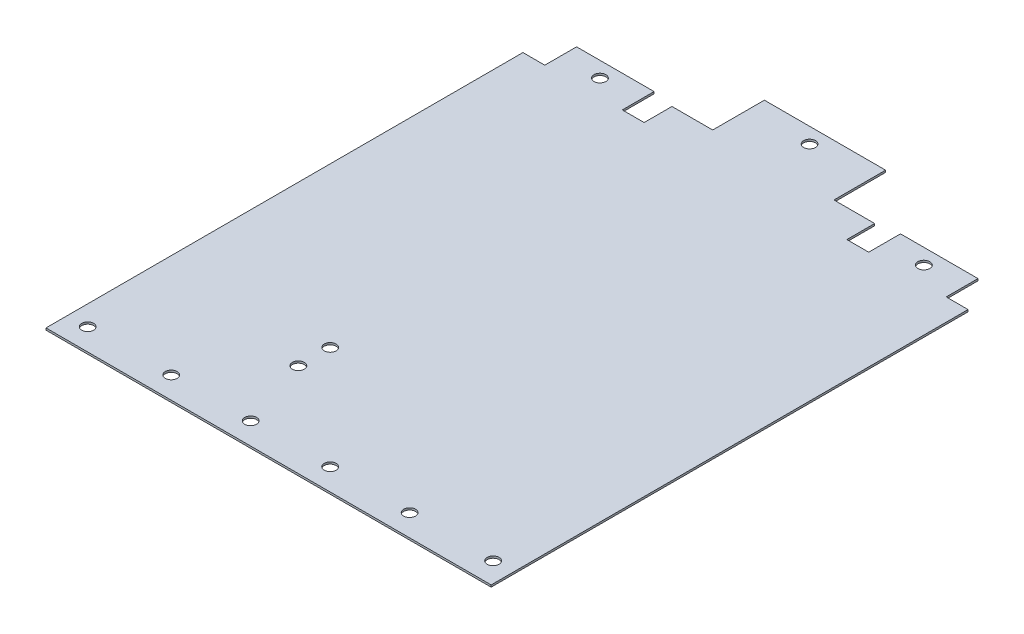
ISO-10303-21;
HEADER;
FILE_DESCRIPTION(('STEP AP214'),'2;1');
FILE_NAME('part.step','',(''),(''),'','','');
FILE_SCHEMA(('AUTOMOTIVE_DESIGN { 1 0 10303 214 1 1 1 1 }'));
ENDSEC;
DATA;
#1=APPLICATION_CONTEXT('core data for automotive mechanical design processes');
#2=APPLICATION_PROTOCOL_DEFINITION('international standard','automotive_design',2000,#1);
#3=PRODUCT_CONTEXT('',#1,'mechanical');
#4=PRODUCT('Part','Part','',(#3));
#5=PRODUCT_RELATED_PRODUCT_CATEGORY('part','',(#4));
#6=PRODUCT_DEFINITION_FORMATION('','',#4);
#7=PRODUCT_DEFINITION_CONTEXT('part definition',#1,'design');
#8=PRODUCT_DEFINITION('design','',#6,#7);
#9=PRODUCT_DEFINITION_SHAPE('','',#8);
#10=(LENGTH_UNIT() NAMED_UNIT(*) SI_UNIT(.MILLI.,.METRE.));
#11=(NAMED_UNIT(*) PLANE_ANGLE_UNIT() SI_UNIT($,.RADIAN.));
#12=(NAMED_UNIT(*) SI_UNIT($,.STERADIAN.) SOLID_ANGLE_UNIT());
#13=UNCERTAINTY_MEASURE_WITH_UNIT(LENGTH_MEASURE(1.E-05),#10,'distance_accuracy_value','');
#14=(GEOMETRIC_REPRESENTATION_CONTEXT(3) GLOBAL_UNCERTAINTY_ASSIGNED_CONTEXT((#13)) GLOBAL_UNIT_ASSIGNED_CONTEXT((#10,
#11,#12)) REPRESENTATION_CONTEXT('',''));
#15=CARTESIAN_POINT('',(0.,0.,0.));
#16=DIRECTION('',(0.,0.,1.));
#17=DIRECTION('',(1.,0.,0.));
#18=AXIS2_PLACEMENT_3D('',#15,#16,#17);
#19=CARTESIAN_POINT('',(-56.,-0.5,-70.));
#20=DIRECTION('',(-1.,0.,0.));
#21=DIRECTION('',(0.,0.,1.));
#22=AXIS2_PLACEMENT_3D('',#19,#20,#21);
#23=PLANE('',#22);
#24=DIRECTION('',(0.,0.,1.));
#25=VECTOR('',#24,1.);
#26=CARTESIAN_POINT('',(-56.,0.,-70.));
#27=LINE('',#26,#25);
#28=CARTESIAN_POINT('',(-56.,0.,-50.));
#29=VERTEX_POINT('',#28);
#30=CARTESIAN_POINT('',(-56.,0.,70.));
#31=VERTEX_POINT('',#30);
#32=EDGE_CURVE('E305',#29,#31,#27,.T.);
#33=ORIENTED_EDGE('',*,*,#32,.F.);
#34=DIRECTION('',(0.,1.,0.));
#35=VECTOR('',#34,1.);
#36=CARTESIAN_POINT('',(-56.,-10.,-50.));
#37=LINE('',#36,#35);
#38=CARTESIAN_POINT('',(-56.,-0.5,-50.));
#39=VERTEX_POINT('',#38);
#40=EDGE_CURVE('E265',#39,#29,#37,.T.);
#41=ORIENTED_EDGE('',*,*,#40,.F.);
#42=DIRECTION('',(0.,0.,1.));
#43=VECTOR('',#42,1.);
#44=CARTESIAN_POINT('',(-56.,-0.5,-70.));
#45=LINE('',#44,#43);
#46=CARTESIAN_POINT('',(-56.,-0.5,70.));
#47=VERTEX_POINT('',#46);
#48=EDGE_CURVE('E306',#39,#47,#45,.T.);
#49=ORIENTED_EDGE('',*,*,#48,.T.);
#50=DIRECTION('',(0.,1.,0.));
#51=VECTOR('',#50,1.);
#52=CARTESIAN_POINT('',(-56.,-0.5,70.));
#53=LINE('',#52,#51);
#54=EDGE_CURVE('E317',#47,#31,#53,.T.);
#55=ORIENTED_EDGE('',*,*,#54,.T.);
#56=EDGE_LOOP('',(#33,#41,#49,#55));
#57=FACE_BOUND('',#56,.T.);
#58=ADVANCED_FACE('F34',(#57),#23,.T.);
#59=CARTESIAN_POINT('',(56.,-0.5,-70.));
#60=DIRECTION('',(0.,0.,-1.));
#61=DIRECTION('',(-1.,0.,0.));
#62=AXIS2_PLACEMENT_3D('',#59,#60,#61);
#63=PLANE('',#62);
#64=DIRECTION('',(0.,1.,0.));
#65=VECTOR('',#64,1.);
#66=CARTESIAN_POINT('',(15.2500000000115,-10.,-70.));
#67=LINE('',#66,#65);
#68=CARTESIAN_POINT('',(15.2500000000115,-0.5,-70.));
#69=VERTEX_POINT('',#68);
#70=CARTESIAN_POINT('',(15.2500000000115,0.,-70.));
#71=VERTEX_POINT('',#70);
#72=EDGE_CURVE('E175',#69,#71,#67,.T.);
#73=ORIENTED_EDGE('',*,*,#72,.F.);
#74=DIRECTION('',(-1.,0.,0.));
#75=VECTOR('',#74,1.);
#76=CARTESIAN_POINT('',(56.,-0.5,-70.));
#77=LINE('',#76,#75);
#78=CARTESIAN_POINT('',(-15.2500000000135,-0.5,-70.));
#79=VERTEX_POINT('',#78);
#80=EDGE_CURVE('E315',#69,#79,#77,.T.);
#81=ORIENTED_EDGE('',*,*,#80,.T.);
#82=DIRECTION('',(0.,1.,0.));
#83=VECTOR('',#82,1.);
#84=CARTESIAN_POINT('',(-15.2500000000135,-10.,-70.));
#85=LINE('',#84,#83);
#86=CARTESIAN_POINT('',(-15.2500000000135,0.,-70.));
#87=VERTEX_POINT('',#86);
#88=EDGE_CURVE('E268',#79,#87,#85,.T.);
#89=ORIENTED_EDGE('',*,*,#88,.T.);
#90=DIRECTION('',(-1.,0.,0.));
#91=VECTOR('',#90,1.);
#92=CARTESIAN_POINT('',(56.,0.,-70.));
#93=LINE('',#92,#91);
#94=EDGE_CURVE('E309',#71,#87,#93,.T.);
#95=ORIENTED_EDGE('',*,*,#94,.F.);
#96=EDGE_LOOP('',(#73,#81,#89,#95));
#97=FACE_BOUND('',#96,.T.);
#98=ADVANCED_FACE('F357',(#97),#63,.T.);
#99=CARTESIAN_POINT('',(-56.,-0.5,70.));
#100=DIRECTION('',(0.,-1.,0.));
#101=DIRECTION('',(0.,0.,-1.));
#102=AXIS2_PLACEMENT_3D('',#99,#100,#101);
#103=PLANE('',#102);
#104=CARTESIAN_POINT('',(51.,-0.5,64.5));
#105=DIRECTION('',(0.,-1.,0.));
#106=DIRECTION('',(0.,0.,-1.));
#107=AXIS2_PLACEMENT_3D('',#104,#105,#106);
#108=CIRCLE('',#107,1.5);
#109=CARTESIAN_POINT('',(51.,-0.5,63.));
#110=VERTEX_POINT('',#109);
#111=EDGE_CURVE('E473',#110,#110,#108,.T.);
#112=ORIENTED_EDGE('',*,*,#111,.F.);
#113=EDGE_LOOP('',(#112));
#114=FACE_BOUND('',#113,.T.);
#115=CARTESIAN_POINT('',(-51.,-0.5,64.5));
#116=DIRECTION('',(0.,-1.,0.));
#117=DIRECTION('',(0.,0.,-1.));
#118=AXIS2_PLACEMENT_3D('',#115,#116,#117);
#119=CIRCLE('',#118,1.5);
#120=CARTESIAN_POINT('',(-51.,-0.5,63.));
#121=VERTEX_POINT('',#120);
#122=EDGE_CURVE('E483',#121,#121,#119,.T.);
#123=ORIENTED_EDGE('',*,*,#122,.F.);
#124=EDGE_LOOP('',(#123));
#125=FACE_BOUND('',#124,.T.);
#126=CARTESIAN_POINT('',(10.,-0.5,64.5));
#127=DIRECTION('',(0.,-1.,0.));
#128=DIRECTION('',(0.,0.,-1.));
#129=AXIS2_PLACEMENT_3D('',#126,#127,#128);
#130=CIRCLE('',#129,1.5);
#131=CARTESIAN_POINT('',(10.,-0.5,63.));
#132=VERTEX_POINT('',#131);
#133=EDGE_CURVE('E489',#132,#132,#130,.T.);
#134=ORIENTED_EDGE('',*,*,#133,.F.);
#135=EDGE_LOOP('',(#134));
#136=FACE_BOUND('',#135,.T.);
#137=CARTESIAN_POINT('',(30.,-0.5,64.5));
#138=DIRECTION('',(0.,-1.,0.));
#139=DIRECTION('',(0.,0.,-1.));
#140=AXIS2_PLACEMENT_3D('',#137,#138,#139);
#141=CIRCLE('',#140,1.5);
#142=CARTESIAN_POINT('',(30.,-0.5,63.));
#143=VERTEX_POINT('',#142);
#144=EDGE_CURVE('E495',#143,#143,#141,.T.);
#145=ORIENTED_EDGE('',*,*,#144,.F.);
#146=EDGE_LOOP('',(#145));
#147=FACE_BOUND('',#146,.T.);
#148=CARTESIAN_POINT('',(-30.,-0.5,64.5));
#149=DIRECTION('',(0.,-1.,0.));
#150=DIRECTION('',(0.,0.,-1.));
#151=AXIS2_PLACEMENT_3D('',#148,#149,#150);
#152=CIRCLE('',#151,1.5);
#153=CARTESIAN_POINT('',(-30.,-0.5,63.));
#154=VERTEX_POINT('',#153);
#155=EDGE_CURVE('E501',#154,#154,#152,.T.);
#156=ORIENTED_EDGE('',*,*,#155,.F.);
#157=EDGE_LOOP('',(#156));
#158=FACE_BOUND('',#157,.T.);
#159=CARTESIAN_POINT('',(-10.,-0.5,64.5));
#160=DIRECTION('',(0.,-1.,0.));
#161=DIRECTION('',(0.,0.,-1.));
#162=AXIS2_PLACEMENT_3D('',#159,#160,#161);
#163=CIRCLE('',#162,1.5);
#164=CARTESIAN_POINT('',(-10.,-0.5,63.));
#165=VERTEX_POINT('',#164);
#166=EDGE_CURVE('E507',#165,#165,#163,.T.);
#167=ORIENTED_EDGE('',*,*,#166,.F.);
#168=EDGE_LOOP('',(#167));
#169=FACE_BOUND('',#168,.T.);
#170=CARTESIAN_POINT('',(-16.,-0.5,46.5));
#171=DIRECTION('',(0.,-1.,0.));
#172=DIRECTION('',(0.,0.,-1.));
#173=AXIS2_PLACEMENT_3D('',#170,#171,#172);
#174=CIRCLE('',#173,1.5);
#175=CARTESIAN_POINT('',(-16.,-0.5,45.));
#176=VERTEX_POINT('',#175);
#177=EDGE_CURVE('E513',#176,#176,#174,.T.);
#178=ORIENTED_EDGE('',*,*,#177,.F.);
#179=EDGE_LOOP('',(#178));
#180=FACE_BOUND('',#179,.T.);
#181=CARTESIAN_POINT('',(-16.,-0.5,38.5));
#182=DIRECTION('',(0.,-1.,0.));
#183=DIRECTION('',(0.,0.,-1.));
#184=AXIS2_PLACEMENT_3D('',#181,#182,#183);
#185=CIRCLE('',#184,1.5);
#186=CARTESIAN_POINT('',(-16.,-0.5,37.));
#187=VERTEX_POINT('',#186);
#188=EDGE_CURVE('E519',#187,#187,#185,.T.);
#189=ORIENTED_EDGE('',*,*,#188,.F.);
#190=EDGE_LOOP('',(#189));
#191=FACE_BOUND('',#190,.T.);
#192=CARTESIAN_POINT('',(40.75,-0.5,-54.125));
#193=DIRECTION('',(0.,-1.,0.));
#194=DIRECTION('',(0.,0.,-1.));
#195=AXIS2_PLACEMENT_3D('',#192,#193,#194);
#196=CIRCLE('',#195,1.5);
#197=CARTESIAN_POINT('',(40.75,-0.5,-55.625));
#198=VERTEX_POINT('',#197);
#199=EDGE_CURVE('E525',#198,#198,#196,.T.);
#200=ORIENTED_EDGE('',*,*,#199,.F.);
#201=EDGE_LOOP('',(#200));
#202=FACE_BOUND('',#201,.T.);
#203=CARTESIAN_POINT('',(0.,-0.5,-66.125));
#204=DIRECTION('',(0.,-1.,0.));
#205=DIRECTION('',(0.,0.,-1.));
#206=AXIS2_PLACEMENT_3D('',#203,#204,#205);
#207=CIRCLE('',#206,1.5);
#208=CARTESIAN_POINT('',(0.,-0.5,-67.625));
#209=VERTEX_POINT('',#208);
#210=EDGE_CURVE('E531',#209,#209,#207,.T.);
#211=ORIENTED_EDGE('',*,*,#210,.F.);
#212=EDGE_LOOP('',(#211));
#213=FACE_BOUND('',#212,.T.);
#214=CARTESIAN_POINT('',(-40.75,-0.5,-54.125));
#215=DIRECTION('',(0.,-1.,0.));
#216=DIRECTION('',(0.,0.,-1.));
#217=AXIS2_PLACEMENT_3D('',#214,#215,#216);
#218=CIRCLE('',#217,1.5);
#219=CARTESIAN_POINT('',(-40.75,-0.5,-55.625));
#220=VERTEX_POINT('',#219);
#221=EDGE_CURVE('E186',#220,#220,#218,.T.);
#222=ORIENTED_EDGE('',*,*,#221,.F.);
#223=EDGE_LOOP('',(#222));
#224=FACE_BOUND('',#223,.T.);
#225=DIRECTION('',(0.,0.,-1.));
#226=VECTOR('',#225,1.);
#227=CARTESIAN_POINT('',(15.25,-0.5,70.));
#228=LINE('',#227,#226);
#229=CARTESIAN_POINT('',(15.25,-0.5,-57.));
#230=VERTEX_POINT('',#229);
#231=EDGE_CURVE('E226',#230,#69,#228,.T.);
#232=ORIENTED_EDGE('',*,*,#231,.F.);
#233=DIRECTION('',(-1.,0.,0.));
#234=VECTOR('',#233,1.);
#235=CARTESIAN_POINT('',(-56.,-0.5,-57.));
#236=LINE('',#235,#234);
#237=CARTESIAN_POINT('',(25.5,-0.5,-57.));
#238=VERTEX_POINT('',#237);
#239=EDGE_CURVE('E228',#238,#230,#236,.T.);
#240=ORIENTED_EDGE('',*,*,#239,.F.);
#241=DIRECTION('',(0.,0.,-1.));
#242=VECTOR('',#241,1.);
#243=CARTESIAN_POINT('',(25.5000000000001,-0.5,69.9999999999999));
#244=LINE('',#243,#242);
#245=CARTESIAN_POINT('',(25.5,-0.5,-50.));
#246=VERTEX_POINT('',#245);
#247=EDGE_CURVE('E230',#246,#238,#244,.T.);
#248=ORIENTED_EDGE('',*,*,#247,.F.);
#249=DIRECTION('',(-1.,0.,0.));
#250=VECTOR('',#249,1.);
#251=CARTESIAN_POINT('',(-55.9999999999998,-0.5,-50.0000000000001));
#252=LINE('',#251,#250);
#253=CARTESIAN_POINT('',(31.,-0.5,-50.));
#254=VERTEX_POINT('',#253);
#255=EDGE_CURVE('E232',#254,#246,#252,.T.);
#256=ORIENTED_EDGE('',*,*,#255,.F.);
#257=DIRECTION('',(0.,0.,-1.));
#258=VECTOR('',#257,1.);
#259=CARTESIAN_POINT('',(30.9999999999999,-0.5,70.0000000000001));
#260=LINE('',#259,#258);
#261=CARTESIAN_POINT('',(31.,-0.5,-58.));
#262=VERTEX_POINT('',#261);
#263=EDGE_CURVE('E234',#254,#262,#260,.T.);
#264=ORIENTED_EDGE('',*,*,#263,.T.);
#265=DIRECTION('',(1.,0.,0.));
#266=VECTOR('',#265,1.);
#267=CARTESIAN_POINT('',(-56.,-0.5,-58.));
#268=LINE('',#267,#266);
#269=CARTESIAN_POINT('',(50.5,-0.5,-58.));
#270=VERTEX_POINT('',#269);
#271=EDGE_CURVE('E237',#262,#270,#268,.T.);
#272=ORIENTED_EDGE('',*,*,#271,.T.);
#273=DIRECTION('',(0.,0.,-1.));
#274=VECTOR('',#273,1.);
#275=CARTESIAN_POINT('',(50.5000000000001,-0.5,69.9999999999999));
#276=LINE('',#275,#274);
#277=CARTESIAN_POINT('',(50.5,-0.5,-50.));
#278=VERTEX_POINT('',#277);
#279=EDGE_CURVE('E240',#278,#270,#276,.T.);
#280=ORIENTED_EDGE('',*,*,#279,.F.);
#281=DIRECTION('',(-1.,0.,0.));
#282=VECTOR('',#281,1.);
#283=CARTESIAN_POINT('',(-56.0000000000001,-0.5,-49.9999999999999));
#284=LINE('',#283,#282);
#285=CARTESIAN_POINT('',(56.,-0.5,-50.));
#286=VERTEX_POINT('',#285);
#287=EDGE_CURVE('E172',#286,#278,#284,.T.);
#288=ORIENTED_EDGE('',*,*,#287,.F.);
#289=DIRECTION('',(0.,0.,-1.));
#290=VECTOR('',#289,1.);
#291=CARTESIAN_POINT('',(56.,-0.5,-70.));
#292=LINE('',#291,#290);
#293=CARTESIAN_POINT('',(56.,-0.5,70.));
#294=VERTEX_POINT('',#293);
#295=EDGE_CURVE('E312',#294,#286,#292,.T.);
#296=ORIENTED_EDGE('',*,*,#295,.F.);
#297=DIRECTION('',(1.,0.,0.));
#298=VECTOR('',#297,1.);
#299=CARTESIAN_POINT('',(56.,-0.5,70.));
#300=LINE('',#299,#298);
#301=EDGE_CURVE('E308',#47,#294,#300,.T.);
#302=ORIENTED_EDGE('',*,*,#301,.F.);
#303=ORIENTED_EDGE('',*,*,#48,.F.);
#304=DIRECTION('',(1.,0.,0.));
#305=VECTOR('',#304,1.);
#306=CARTESIAN_POINT('',(-56.0000000000001,-0.5,-50.));
#307=LINE('',#306,#305);
#308=CARTESIAN_POINT('',(-50.5,-0.5,-50.));
#309=VERTEX_POINT('',#308);
#310=EDGE_CURVE('E302',#39,#309,#307,.T.);
#311=ORIENTED_EDGE('',*,*,#310,.T.);
#312=DIRECTION('',(0.,0.,-1.));
#313=VECTOR('',#312,1.);
#314=CARTESIAN_POINT('',(-50.5000000000001,-0.5,70.));
#315=LINE('',#314,#313);
#316=CARTESIAN_POINT('',(-50.5,-0.5,-58.));
#317=VERTEX_POINT('',#316);
#318=EDGE_CURVE('E267',#309,#317,#315,.T.);
#319=ORIENTED_EDGE('',*,*,#318,.T.);
#320=DIRECTION('',(-1.,0.,0.));
#321=VECTOR('',#320,1.);
#322=CARTESIAN_POINT('',(-56.,-0.5,-58.));
#323=LINE('',#322,#321);
#324=CARTESIAN_POINT('',(-31.,-0.5,-58.));
#325=VERTEX_POINT('',#324);
#326=EDGE_CURVE('E286',#325,#317,#323,.T.);
#327=ORIENTED_EDGE('',*,*,#326,.F.);
#328=DIRECTION('',(0.,0.,-1.));
#329=VECTOR('',#328,1.);
#330=CARTESIAN_POINT('',(-30.9999999999999,-0.5,70.));
#331=LINE('',#330,#329);
#332=CARTESIAN_POINT('',(-31.,-0.5,-50.));
#333=VERTEX_POINT('',#332);
#334=EDGE_CURVE('E288',#333,#325,#331,.T.);
#335=ORIENTED_EDGE('',*,*,#334,.F.);
#336=DIRECTION('',(1.,0.,0.));
#337=VECTOR('',#336,1.);
#338=CARTESIAN_POINT('',(-56.,-0.5,-50.));
#339=LINE('',#338,#337);
#340=CARTESIAN_POINT('',(-25.5,-0.5,-50.));
#341=VERTEX_POINT('',#340);
#342=EDGE_CURVE('E290',#333,#341,#339,.T.);
#343=ORIENTED_EDGE('',*,*,#342,.T.);
#344=DIRECTION('',(0.,0.,-1.));
#345=VECTOR('',#344,1.);
#346=CARTESIAN_POINT('',(-25.5,-0.5,70.));
#347=LINE('',#346,#345);
#348=CARTESIAN_POINT('',(-25.5,-0.5,-57.));
#349=VERTEX_POINT('',#348);
#350=EDGE_CURVE('E293',#341,#349,#347,.T.);
#351=ORIENTED_EDGE('',*,*,#350,.T.);
#352=DIRECTION('',(1.,0.,0.));
#353=VECTOR('',#352,1.);
#354=CARTESIAN_POINT('',(-56.,-0.5,-57.));
#355=LINE('',#354,#353);
#356=CARTESIAN_POINT('',(-15.25,-0.5,-57.));
#357=VERTEX_POINT('',#356);
#358=EDGE_CURVE('E296',#349,#357,#355,.T.);
#359=ORIENTED_EDGE('',*,*,#358,.T.);
#360=DIRECTION('',(0.,0.,-1.));
#361=VECTOR('',#360,1.);
#362=CARTESIAN_POINT('',(-15.25,-0.5,70.));
#363=LINE('',#362,#361);
#364=EDGE_CURVE('E299',#357,#79,#363,.T.);
#365=ORIENTED_EDGE('',*,*,#364,.T.);
#366=ORIENTED_EDGE('',*,*,#80,.F.);
#367=EDGE_LOOP('',(#232,#240,#248,#256,#264,#272,#280,#288,#296,#302,#303,#311,#319,#327,#335,
#343,#351,#359,#365,#366));
#368=FACE_BOUND('',#367,.T.);
#369=ADVANCED_FACE('F342',(#114,#125,#136,#147,#158,#169,#180,#191,#202,#213,#224,#368),#103,.T.);
#370=CARTESIAN_POINT('',(-56.,0.,70.));
#371=DIRECTION('',(0.,-1.,0.));
#372=DIRECTION('',(0.,0.,-1.));
#373=AXIS2_PLACEMENT_3D('',#370,#371,#372);
#374=PLANE('',#373);
#375=CARTESIAN_POINT('',(51.,0.,64.5));
#376=DIRECTION('',(0.,1.,0.));
#377=DIRECTION('',(0.,0.,-1.));
#378=AXIS2_PLACEMENT_3D('',#375,#376,#377);
#379=CIRCLE('',#378,1.5);
#380=CARTESIAN_POINT('',(51.,0.,63.));
#381=VERTEX_POINT('',#380);
#382=EDGE_CURVE('E476',#381,#381,#379,.T.);
#383=ORIENTED_EDGE('',*,*,#382,.F.);
#384=EDGE_LOOP('',(#383));
#385=FACE_BOUND('',#384,.T.);
#386=CARTESIAN_POINT('',(-51.,0.,64.5));
#387=DIRECTION('',(0.,1.,0.));
#388=DIRECTION('',(0.,0.,1.));
#389=AXIS2_PLACEMENT_3D('',#386,#387,#388);
#390=CIRCLE('',#389,1.5);
#391=CARTESIAN_POINT('',(-51.,0.,66.));
#392=VERTEX_POINT('',#391);
#393=EDGE_CURVE('E478',#392,#392,#390,.T.);
#394=ORIENTED_EDGE('',*,*,#393,.F.);
#395=EDGE_LOOP('',(#394));
#396=FACE_BOUND('',#395,.T.);
#397=CARTESIAN_POINT('',(10.,0.,64.5));
#398=DIRECTION('',(0.,1.,0.));
#399=DIRECTION('',(0.,0.,-1.));
#400=AXIS2_PLACEMENT_3D('',#397,#398,#399);
#401=CIRCLE('',#400,1.5);
#402=CARTESIAN_POINT('',(10.,0.,63.));
#403=VERTEX_POINT('',#402);
#404=EDGE_CURVE('E486',#403,#403,#401,.T.);
#405=ORIENTED_EDGE('',*,*,#404,.F.);
#406=EDGE_LOOP('',(#405));
#407=FACE_BOUND('',#406,.T.);
#408=CARTESIAN_POINT('',(30.,0.,64.5));
#409=DIRECTION('',(0.,1.,0.));
#410=DIRECTION('',(0.,0.,-1.));
#411=AXIS2_PLACEMENT_3D('',#408,#409,#410);
#412=CIRCLE('',#411,1.5);
#413=CARTESIAN_POINT('',(30.,0.,63.));
#414=VERTEX_POINT('',#413);
#415=EDGE_CURVE('E492',#414,#414,#412,.T.);
#416=ORIENTED_EDGE('',*,*,#415,.F.);
#417=EDGE_LOOP('',(#416));
#418=FACE_BOUND('',#417,.T.);
#419=CARTESIAN_POINT('',(-30.,0.,64.5));
#420=DIRECTION('',(0.,1.,0.));
#421=DIRECTION('',(0.,0.,1.));
#422=AXIS2_PLACEMENT_3D('',#419,#420,#421);
#423=CIRCLE('',#422,1.5);
#424=CARTESIAN_POINT('',(-30.,0.,66.));
#425=VERTEX_POINT('',#424);
#426=EDGE_CURVE('E498',#425,#425,#423,.T.);
#427=ORIENTED_EDGE('',*,*,#426,.F.);
#428=EDGE_LOOP('',(#427));
#429=FACE_BOUND('',#428,.T.);
#430=CARTESIAN_POINT('',(-10.,0.,64.5));
#431=DIRECTION('',(0.,1.,0.));
#432=DIRECTION('',(0.,0.,1.));
#433=AXIS2_PLACEMENT_3D('',#430,#431,#432);
#434=CIRCLE('',#433,1.5);
#435=CARTESIAN_POINT('',(-10.,0.,66.));
#436=VERTEX_POINT('',#435);
#437=EDGE_CURVE('E504',#436,#436,#434,.T.);
#438=ORIENTED_EDGE('',*,*,#437,.F.);
#439=EDGE_LOOP('',(#438));
#440=FACE_BOUND('',#439,.T.);
#441=CARTESIAN_POINT('',(-16.,0.,46.5));
#442=DIRECTION('',(0.,1.,0.));
#443=DIRECTION('',(0.,0.,-1.));
#444=AXIS2_PLACEMENT_3D('',#441,#442,#443);
#445=CIRCLE('',#444,1.5);
#446=CARTESIAN_POINT('',(-16.,0.,45.));
#447=VERTEX_POINT('',#446);
#448=EDGE_CURVE('E510',#447,#447,#445,.T.);
#449=ORIENTED_EDGE('',*,*,#448,.F.);
#450=EDGE_LOOP('',(#449));
#451=FACE_BOUND('',#450,.T.);
#452=CARTESIAN_POINT('',(-16.,0.,38.5));
#453=DIRECTION('',(0.,1.,0.));
#454=DIRECTION('',(0.,0.,1.));
#455=AXIS2_PLACEMENT_3D('',#452,#453,#454);
#456=CIRCLE('',#455,1.5);
#457=CARTESIAN_POINT('',(-16.,0.,40.));
#458=VERTEX_POINT('',#457);
#459=EDGE_CURVE('E516',#458,#458,#456,.T.);
#460=ORIENTED_EDGE('',*,*,#459,.F.);
#461=EDGE_LOOP('',(#460));
#462=FACE_BOUND('',#461,.T.);
#463=CARTESIAN_POINT('',(40.75,0.,-54.125));
#464=DIRECTION('',(0.,1.,0.));
#465=DIRECTION('',(0.,0.,-1.));
#466=AXIS2_PLACEMENT_3D('',#463,#464,#465);
#467=CIRCLE('',#466,1.5);
#468=CARTESIAN_POINT('',(40.75,0.,-55.625));
#469=VERTEX_POINT('',#468);
#470=EDGE_CURVE('E522',#469,#469,#467,.T.);
#471=ORIENTED_EDGE('',*,*,#470,.F.);
#472=EDGE_LOOP('',(#471));
#473=FACE_BOUND('',#472,.T.);
#474=CARTESIAN_POINT('',(0.,0.,-66.125));
#475=DIRECTION('',(0.,1.,0.));
#476=DIRECTION('',(0.,0.,1.));
#477=AXIS2_PLACEMENT_3D('',#474,#475,#476);
#478=CIRCLE('',#477,1.5);
#479=CARTESIAN_POINT('',(0.,0.,-64.625));
#480=VERTEX_POINT('',#479);
#481=EDGE_CURVE('E528',#480,#480,#478,.T.);
#482=ORIENTED_EDGE('',*,*,#481,.F.);
#483=EDGE_LOOP('',(#482));
#484=FACE_BOUND('',#483,.T.);
#485=CARTESIAN_POINT('',(-40.75,0.,-54.125));
#486=DIRECTION('',(0.,1.,0.));
#487=DIRECTION('',(0.,0.,1.));
#488=AXIS2_PLACEMENT_3D('',#485,#486,#487);
#489=CIRCLE('',#488,1.5);
#490=CARTESIAN_POINT('',(-40.75,0.,-52.625));
#491=VERTEX_POINT('',#490);
#492=EDGE_CURVE('E534',#491,#491,#489,.T.);
#493=ORIENTED_EDGE('',*,*,#492,.F.);
#494=EDGE_LOOP('',(#493));
#495=FACE_BOUND('',#494,.T.);
#496=DIRECTION('',(1.,0.,0.));
#497=VECTOR('',#496,1.);
#498=CARTESIAN_POINT('',(-139.602165088336,0.,-57.));
#499=LINE('',#498,#497);
#500=CARTESIAN_POINT('',(15.25,0.,-57.));
#501=VERTEX_POINT('',#500);
#502=CARTESIAN_POINT('',(25.5,0.,-57.));
#503=VERTEX_POINT('',#502);
#504=EDGE_CURVE('E197',#501,#503,#499,.T.);
#505=ORIENTED_EDGE('',*,*,#504,.F.);
#506=DIRECTION('',(0.,0.,1.));
#507=VECTOR('',#506,1.);
#508=CARTESIAN_POINT('',(15.25,0.,-0.00643135245991444));
#509=LINE('',#508,#507);
#510=EDGE_CURVE('E194',#71,#501,#509,.T.);
#511=ORIENTED_EDGE('',*,*,#510,.F.);
#512=ORIENTED_EDGE('',*,*,#94,.T.);
#513=DIRECTION('',(0.,0.,1.));
#514=VECTOR('',#513,1.);
#515=CARTESIAN_POINT('',(-15.25,0.,-0.00643135245991037));
#516=LINE('',#515,#514);
#517=CARTESIAN_POINT('',(-15.25,0.,-57.));
#518=VERTEX_POINT('',#517);
#519=EDGE_CURVE('E261',#87,#518,#516,.T.);
#520=ORIENTED_EDGE('',*,*,#519,.T.);
#521=DIRECTION('',(-1.,0.,0.));
#522=VECTOR('',#521,1.);
#523=CARTESIAN_POINT('',(-139.602165088336,0.,-57.));
#524=LINE('',#523,#522);
#525=CARTESIAN_POINT('',(-25.5,0.,-57.));
#526=VERTEX_POINT('',#525);
#527=EDGE_CURVE('E258',#518,#526,#524,.T.);
#528=ORIENTED_EDGE('',*,*,#527,.T.);
#529=DIRECTION('',(0.,0.,1.));
#530=VECTOR('',#529,1.);
#531=CARTESIAN_POINT('',(-25.5,0.,-0.00643135245989378));
#532=LINE('',#531,#530);
#533=CARTESIAN_POINT('',(-25.5,0.,-50.));
#534=VERTEX_POINT('',#533);
#535=EDGE_CURVE('E255',#526,#534,#532,.T.);
#536=ORIENTED_EDGE('',*,*,#535,.T.);
#537=DIRECTION('',(-1.,0.,0.));
#538=VECTOR('',#537,1.);
#539=CARTESIAN_POINT('',(-139.602165088336,0.,-50.));
#540=LINE('',#539,#538);
#541=CARTESIAN_POINT('',(-31.,0.,-50.));
#542=VERTEX_POINT('',#541);
#543=EDGE_CURVE('E252',#534,#542,#540,.T.);
#544=ORIENTED_EDGE('',*,*,#543,.T.);
#545=DIRECTION('',(0.,0.,1.));
#546=VECTOR('',#545,1.);
#547=CARTESIAN_POINT('',(-30.9999999999999,0.,-0.00643135245998798));
#548=LINE('',#547,#546);
#549=CARTESIAN_POINT('',(-31.,0.,-58.));
#550=VERTEX_POINT('',#549);
#551=EDGE_CURVE('E249',#550,#542,#548,.T.);
#552=ORIENTED_EDGE('',*,*,#551,.F.);
#553=DIRECTION('',(1.,0.,0.));
#554=VECTOR('',#553,1.);
#555=CARTESIAN_POINT('',(-139.602165088336,0.,-58.));
#556=LINE('',#555,#554);
#557=CARTESIAN_POINT('',(-50.5,0.,-58.));
#558=VERTEX_POINT('',#557);
#559=EDGE_CURVE('E246',#558,#550,#556,.T.);
#560=ORIENTED_EDGE('',*,*,#559,.F.);
#561=DIRECTION('',(0.,0.,1.));
#562=VECTOR('',#561,1.);
#563=CARTESIAN_POINT('',(-50.5,0.,-0.0064313524598165));
#564=LINE('',#563,#562);
#565=CARTESIAN_POINT('',(-50.5,0.,-50.));
#566=VERTEX_POINT('',#565);
#567=EDGE_CURVE('E243',#558,#566,#564,.T.);
#568=ORIENTED_EDGE('',*,*,#567,.T.);
#569=DIRECTION('',(-1.,0.,0.));
#570=VECTOR('',#569,1.);
#571=CARTESIAN_POINT('',(-139.602165088336,0.,-49.9999999999999));
#572=LINE('',#571,#570);
#573=EDGE_CURVE('E55',#566,#29,#572,.T.);
#574=ORIENTED_EDGE('',*,*,#573,.T.);
#575=ORIENTED_EDGE('',*,*,#32,.T.);
#576=DIRECTION('',(1.,0.,0.));
#577=VECTOR('',#576,1.);
#578=CARTESIAN_POINT('',(56.,0.,70.));
#579=LINE('',#578,#577);
#580=CARTESIAN_POINT('',(56.,0.,70.));
#581=VERTEX_POINT('',#580);
#582=EDGE_CURVE('E319',#31,#581,#579,.T.);
#583=ORIENTED_EDGE('',*,*,#582,.T.);
#584=DIRECTION('',(0.,0.,-1.));
#585=VECTOR('',#584,1.);
#586=CARTESIAN_POINT('',(56.,0.,-70.));
#587=LINE('',#586,#585);
#588=CARTESIAN_POINT('',(56.,0.,-50.));
#589=VERTEX_POINT('',#588);
#590=EDGE_CURVE('E193',#581,#589,#587,.T.);
#591=ORIENTED_EDGE('',*,*,#590,.T.);
#592=DIRECTION('',(1.,0.,0.));
#593=VECTOR('',#592,1.);
#594=CARTESIAN_POINT('',(-139.602165088336,0.,-49.9999999999998));
#595=LINE('',#594,#593);
#596=CARTESIAN_POINT('',(50.5,0.,-50.));
#597=VERTEX_POINT('',#596);
#598=EDGE_CURVE('E47',#597,#589,#595,.T.);
#599=ORIENTED_EDGE('',*,*,#598,.F.);
#600=DIRECTION('',(0.,0.,1.));
#601=VECTOR('',#600,1.);
#602=CARTESIAN_POINT('',(50.5,0.,-0.00643135246005867));
#603=LINE('',#602,#601);
#604=CARTESIAN_POINT('',(50.5,0.,-58.));
#605=VERTEX_POINT('',#604);
#606=EDGE_CURVE('E179',#605,#597,#603,.T.);
#607=ORIENTED_EDGE('',*,*,#606,.F.);
#608=DIRECTION('',(-1.,0.,0.));
#609=VECTOR('',#608,1.);
#610=CARTESIAN_POINT('',(-139.602165088336,0.,-58.));
#611=LINE('',#610,#609);
#612=CARTESIAN_POINT('',(31.,0.,-58.));
#613=VERTEX_POINT('',#612);
#614=EDGE_CURVE('E176',#605,#613,#611,.T.);
#615=ORIENTED_EDGE('',*,*,#614,.T.);
#616=DIRECTION('',(0.,0.,1.));
#617=VECTOR('',#616,1.);
#618=CARTESIAN_POINT('',(30.9999999999999,0.,-0.00643135245974581));
#619=LINE('',#618,#617);
#620=CARTESIAN_POINT('',(31.,0.,-50.));
#621=VERTEX_POINT('',#620);
#622=EDGE_CURVE('E209',#613,#621,#619,.T.);
#623=ORIENTED_EDGE('',*,*,#622,.T.);
#624=DIRECTION('',(1.,0.,0.));
#625=VECTOR('',#624,1.);
#626=CARTESIAN_POINT('',(-139.602165088336,0.,-50.0000000000002));
#627=LINE('',#626,#625);
#628=CARTESIAN_POINT('',(25.5,0.,-50.));
#629=VERTEX_POINT('',#628);
#630=EDGE_CURVE('E206',#629,#621,#627,.T.);
#631=ORIENTED_EDGE('',*,*,#630,.F.);
#632=DIRECTION('',(0.,0.,1.));
#633=VECTOR('',#632,1.);
#634=CARTESIAN_POINT('',(25.5,0.,-0.00643135246005744));
#635=LINE('',#634,#633);
#636=EDGE_CURVE('E203',#503,#629,#635,.T.);
#637=ORIENTED_EDGE('',*,*,#636,.F.);
#638=EDGE_LOOP('',(#505,#511,#512,#520,#528,#536,#544,#552,#560,#568,#574,#575,#583,#591,#599,
#607,#615,#623,#631,#637));
#639=FACE_BOUND('',#638,.T.);
#640=ADVANCED_FACE('F190',(#385,#396,#407,#418,#429,#440,#451,#462,#473,#484,#495,#639),#374,.F.);
#641=CARTESIAN_POINT('',(56.,-0.5,-70.));
#642=DIRECTION('',(1.,0.,0.));
#643=DIRECTION('',(0.,0.,-1.));
#644=AXIS2_PLACEMENT_3D('',#641,#642,#643);
#645=PLANE('',#644);
#646=DIRECTION('',(0.,-1.,0.));
#647=VECTOR('',#646,1.);
#648=CARTESIAN_POINT('',(56.,-0.5,-50.));
#649=LINE('',#648,#647);
#650=EDGE_CURVE('E11',#589,#286,#649,.T.);
#651=ORIENTED_EDGE('',*,*,#650,.F.);
#652=ORIENTED_EDGE('',*,*,#590,.F.);
#653=DIRECTION('',(0.,1.,0.));
#654=VECTOR('',#653,1.);
#655=CARTESIAN_POINT('',(56.,-0.5,70.));
#656=LINE('',#655,#654);
#657=EDGE_CURVE('E41',#294,#581,#656,.T.);
#658=ORIENTED_EDGE('',*,*,#657,.F.);
#659=ORIENTED_EDGE('',*,*,#295,.T.);
#660=EDGE_LOOP('',(#651,#652,#658,#659));
#661=FACE_BOUND('',#660,.T.);
#662=ADVANCED_FACE('F346',(#661),#645,.T.);
#663=CARTESIAN_POINT('',(56.,-0.5,70.));
#664=DIRECTION('',(0.,0.,1.));
#665=DIRECTION('',(1.,0.,0.));
#666=AXIS2_PLACEMENT_3D('',#663,#664,#665);
#667=PLANE('',#666);
#668=ORIENTED_EDGE('',*,*,#582,.F.);
#669=ORIENTED_EDGE('',*,*,#54,.F.);
#670=ORIENTED_EDGE('',*,*,#301,.T.);
#671=ORIENTED_EDGE('',*,*,#657,.T.);
#672=EDGE_LOOP('',(#668,#669,#670,#671));
#673=FACE_BOUND('',#672,.T.);
#674=ADVANCED_FACE('F332',(#673),#667,.T.);
#675=CARTESIAN_POINT('',(-139.602165088336,-10.,-49.9999999999999));
#676=DIRECTION('',(0.,0.,-1.));
#677=DIRECTION('',(-1.,0.,0.));
#678=AXIS2_PLACEMENT_3D('',#675,#676,#677);
#679=PLANE('',#678);
#680=ORIENTED_EDGE('',*,*,#40,.T.);
#681=ORIENTED_EDGE('',*,*,#573,.F.);
#682=DIRECTION('',(0.,1.,0.));
#683=VECTOR('',#682,1.);
#684=CARTESIAN_POINT('',(-50.5,-10.,-50.));
#685=LINE('',#684,#683);
#686=EDGE_CURVE('E264',#309,#566,#685,.T.);
#687=ORIENTED_EDGE('',*,*,#686,.F.);
#688=ORIENTED_EDGE('',*,*,#310,.F.);
#689=EDGE_LOOP('',(#680,#681,#687,#688));
#690=FACE_BOUND('',#689,.T.);
#691=ADVANCED_FACE('F339',(#690),#679,.T.);
#692=CARTESIAN_POINT('',(-15.25,-10.,-0.00643135245991037));
#693=DIRECTION('',(-1.,0.,0.));
#694=DIRECTION('',(0.,0.,1.));
#695=AXIS2_PLACEMENT_3D('',#692,#693,#694);
#696=PLANE('',#695);
#697=DIRECTION('',(0.,1.,0.));
#698=VECTOR('',#697,1.);
#699=CARTESIAN_POINT('',(-15.25,-10.,-57.));
#700=LINE('',#699,#698);
#701=EDGE_CURVE('E271',#357,#518,#700,.T.);
#702=ORIENTED_EDGE('',*,*,#701,.T.);
#703=ORIENTED_EDGE('',*,*,#519,.F.);
#704=ORIENTED_EDGE('',*,*,#88,.F.);
#705=ORIENTED_EDGE('',*,*,#364,.F.);
#706=EDGE_LOOP('',(#702,#703,#704,#705));
#707=FACE_BOUND('',#706,.T.);
#708=ADVANCED_FACE('F371',(#707),#696,.T.);
#709=CARTESIAN_POINT('',(-139.602165088336,-10.,-57.));
#710=DIRECTION('',(0.,0.,-1.));
#711=DIRECTION('',(-1.,0.,0.));
#712=AXIS2_PLACEMENT_3D('',#709,#710,#711);
#713=PLANE('',#712);
#714=DIRECTION('',(0.,1.,0.));
#715=VECTOR('',#714,1.);
#716=CARTESIAN_POINT('',(-25.5,-10.,-57.));
#717=LINE('',#716,#715);
#718=EDGE_CURVE('E273',#349,#526,#717,.T.);
#719=ORIENTED_EDGE('',*,*,#718,.T.);
#720=ORIENTED_EDGE('',*,*,#527,.F.);
#721=ORIENTED_EDGE('',*,*,#701,.F.);
#722=ORIENTED_EDGE('',*,*,#358,.F.);
#723=EDGE_LOOP('',(#719,#720,#721,#722));
#724=FACE_BOUND('',#723,.T.);
#725=ADVANCED_FACE('F389',(#724),#713,.T.);
#726=CARTESIAN_POINT('',(-25.5,-10.,-0.00643135245989378));
#727=DIRECTION('',(-1.,0.,0.));
#728=DIRECTION('',(0.,0.,1.));
#729=AXIS2_PLACEMENT_3D('',#726,#727,#728);
#730=PLANE('',#729);
#731=DIRECTION('',(0.,1.,0.));
#732=VECTOR('',#731,1.);
#733=CARTESIAN_POINT('',(-25.5,-10.,-50.));
#734=LINE('',#733,#732);
#735=EDGE_CURVE('E275',#341,#534,#734,.T.);
#736=ORIENTED_EDGE('',*,*,#735,.T.);
#737=ORIENTED_EDGE('',*,*,#535,.F.);
#738=ORIENTED_EDGE('',*,*,#718,.F.);
#739=ORIENTED_EDGE('',*,*,#350,.F.);
#740=EDGE_LOOP('',(#736,#737,#738,#739));
#741=FACE_BOUND('',#740,.T.);
#742=ADVANCED_FACE('F385',(#741),#730,.T.);
#743=CARTESIAN_POINT('',(-139.602165088336,-10.,-50.));
#744=DIRECTION('',(0.,0.,-1.));
#745=DIRECTION('',(-1.,0.,0.));
#746=AXIS2_PLACEMENT_3D('',#743,#744,#745);
#747=PLANE('',#746);
#748=DIRECTION('',(0.,1.,0.));
#749=VECTOR('',#748,1.);
#750=CARTESIAN_POINT('',(-31.,-10.,-50.));
#751=LINE('',#750,#749);
#752=EDGE_CURVE('E277',#333,#542,#751,.T.);
#753=ORIENTED_EDGE('',*,*,#752,.T.);
#754=ORIENTED_EDGE('',*,*,#543,.F.);
#755=ORIENTED_EDGE('',*,*,#735,.F.);
#756=ORIENTED_EDGE('',*,*,#342,.F.);
#757=EDGE_LOOP('',(#753,#754,#755,#756));
#758=FACE_BOUND('',#757,.T.);
#759=ADVANCED_FACE('F381',(#758),#747,.T.);
#760=CARTESIAN_POINT('',(-30.9999999999999,-10.,-0.00643135245998798));
#761=DIRECTION('',(-1.,0.,0.));
#762=DIRECTION('',(0.,0.,1.));
#763=AXIS2_PLACEMENT_3D('',#760,#761,#762);
#764=PLANE('',#763);
#765=ORIENTED_EDGE('',*,*,#334,.T.);
#766=DIRECTION('',(0.,1.,0.));
#767=VECTOR('',#766,1.);
#768=CARTESIAN_POINT('',(-31.,-10.,-58.));
#769=LINE('',#768,#767);
#770=EDGE_CURVE('E279',#325,#550,#769,.T.);
#771=ORIENTED_EDGE('',*,*,#770,.T.);
#772=ORIENTED_EDGE('',*,*,#551,.T.);
#773=ORIENTED_EDGE('',*,*,#752,.F.);
#774=EDGE_LOOP('',(#765,#771,#772,#773));
#775=FACE_BOUND('',#774,.T.);
#776=ADVANCED_FACE('F377',(#775),#764,.F.);
#777=CARTESIAN_POINT('',(-139.602165088336,-10.,-58.));
#778=DIRECTION('',(0.,0.,1.));
#779=DIRECTION('',(1.,0.,0.));
#780=AXIS2_PLACEMENT_3D('',#777,#778,#779);
#781=PLANE('',#780);
#782=ORIENTED_EDGE('',*,*,#326,.T.);
#783=DIRECTION('',(0.,1.,0.));
#784=VECTOR('',#783,1.);
#785=CARTESIAN_POINT('',(-50.5,-10.,-58.));
#786=LINE('',#785,#784);
#787=EDGE_CURVE('E281',#317,#558,#786,.T.);
#788=ORIENTED_EDGE('',*,*,#787,.T.);
#789=ORIENTED_EDGE('',*,*,#559,.T.);
#790=ORIENTED_EDGE('',*,*,#770,.F.);
#791=EDGE_LOOP('',(#782,#788,#789,#790));
#792=FACE_BOUND('',#791,.T.);
#793=ADVANCED_FACE('F374',(#792),#781,.F.);
#794=CARTESIAN_POINT('',(-50.5,-10.,-0.0064313524598165));
#795=DIRECTION('',(-1.,0.,0.));
#796=DIRECTION('',(0.,0.,1.));
#797=AXIS2_PLACEMENT_3D('',#794,#795,#796);
#798=PLANE('',#797);
#799=ORIENTED_EDGE('',*,*,#686,.T.);
#800=ORIENTED_EDGE('',*,*,#567,.F.);
#801=ORIENTED_EDGE('',*,*,#787,.F.);
#802=ORIENTED_EDGE('',*,*,#318,.F.);
#803=EDGE_LOOP('',(#799,#800,#801,#802));
#804=FACE_BOUND('',#803,.T.);
#805=ADVANCED_FACE('F338',(#804),#798,.T.);
#806=CARTESIAN_POINT('',(50.5,-10.,-0.00643135246005867));
#807=DIRECTION('',(-1.,0.,0.));
#808=DIRECTION('',(0.,0.,1.));
#809=AXIS2_PLACEMENT_3D('',#806,#807,#808);
#810=PLANE('',#809);
#811=ORIENTED_EDGE('',*,*,#279,.T.);
#812=DIRECTION('',(0.,1.,0.));
#813=VECTOR('',#812,1.);
#814=CARTESIAN_POINT('',(50.5,-10.,-58.));
#815=LINE('',#814,#813);
#816=EDGE_CURVE('E182',#270,#605,#815,.T.);
#817=ORIENTED_EDGE('',*,*,#816,.T.);
#818=ORIENTED_EDGE('',*,*,#606,.T.);
#819=DIRECTION('',(0.,1.,0.));
#820=VECTOR('',#819,1.);
#821=CARTESIAN_POINT('',(50.5,-10.,-50.));
#822=LINE('',#821,#820);
#823=EDGE_CURVE('E168',#278,#597,#822,.T.);
#824=ORIENTED_EDGE('',*,*,#823,.F.);
#825=EDGE_LOOP('',(#811,#817,#818,#824));
#826=FACE_BOUND('',#825,.T.);
#827=ADVANCED_FACE('F180',(#826),#810,.F.);
#828=CARTESIAN_POINT('',(-139.602165088336,-10.,-58.));
#829=DIRECTION('',(0.,0.,-1.));
#830=DIRECTION('',(-1.,0.,0.));
#831=AXIS2_PLACEMENT_3D('',#828,#829,#830);
#832=PLANE('',#831);
#833=DIRECTION('',(0.,1.,0.));
#834=VECTOR('',#833,1.);
#835=CARTESIAN_POINT('',(31.,-10.,-58.));
#836=LINE('',#835,#834);
#837=EDGE_CURVE('E214',#262,#613,#836,.T.);
#838=ORIENTED_EDGE('',*,*,#837,.T.);
#839=ORIENTED_EDGE('',*,*,#614,.F.);
#840=ORIENTED_EDGE('',*,*,#816,.F.);
#841=ORIENTED_EDGE('',*,*,#271,.F.);
#842=EDGE_LOOP('',(#838,#839,#840,#841));
#843=FACE_BOUND('',#842,.T.);
#844=ADVANCED_FACE('F399',(#843),#832,.T.);
#845=CARTESIAN_POINT('',(30.9999999999999,-10.,-0.00643135245974581));
#846=DIRECTION('',(-1.,0.,0.));
#847=DIRECTION('',(0.,0.,1.));
#848=AXIS2_PLACEMENT_3D('',#845,#846,#847);
#849=PLANE('',#848);
#850=DIRECTION('',(0.,1.,0.));
#851=VECTOR('',#850,1.);
#852=CARTESIAN_POINT('',(31.,-10.,-50.));
#853=LINE('',#852,#851);
#854=EDGE_CURVE('E216',#254,#621,#853,.T.);
#855=ORIENTED_EDGE('',*,*,#854,.T.);
#856=ORIENTED_EDGE('',*,*,#622,.F.);
#857=ORIENTED_EDGE('',*,*,#837,.F.);
#858=ORIENTED_EDGE('',*,*,#263,.F.);
#859=EDGE_LOOP('',(#855,#856,#857,#858));
#860=FACE_BOUND('',#859,.T.);
#861=ADVANCED_FACE('F418',(#860),#849,.T.);
#862=CARTESIAN_POINT('',(-139.602165088336,-10.,-50.0000000000002));
#863=DIRECTION('',(0.,0.,1.));
#864=DIRECTION('',(1.,0.,0.));
#865=AXIS2_PLACEMENT_3D('',#862,#863,#864);
#866=PLANE('',#865);
#867=ORIENTED_EDGE('',*,*,#255,.T.);
#868=DIRECTION('',(0.,1.,0.));
#869=VECTOR('',#868,1.);
#870=CARTESIAN_POINT('',(25.5,-10.,-50.));
#871=LINE('',#870,#869);
#872=EDGE_CURVE('E218',#246,#629,#871,.T.);
#873=ORIENTED_EDGE('',*,*,#872,.T.);
#874=ORIENTED_EDGE('',*,*,#630,.T.);
#875=ORIENTED_EDGE('',*,*,#854,.F.);
#876=EDGE_LOOP('',(#867,#873,#874,#875));
#877=FACE_BOUND('',#876,.T.);
#878=ADVANCED_FACE('F414',(#877),#866,.F.);
#879=CARTESIAN_POINT('',(25.5,-10.,-0.00643135246005744));
#880=DIRECTION('',(-1.,0.,0.));
#881=DIRECTION('',(0.,0.,1.));
#882=AXIS2_PLACEMENT_3D('',#879,#880,#881);
#883=PLANE('',#882);
#884=ORIENTED_EDGE('',*,*,#247,.T.);
#885=DIRECTION('',(0.,1.,0.));
#886=VECTOR('',#885,1.);
#887=CARTESIAN_POINT('',(25.5,-10.,-57.));
#888=LINE('',#887,#886);
#889=EDGE_CURVE('E220',#238,#503,#888,.T.);
#890=ORIENTED_EDGE('',*,*,#889,.T.);
#891=ORIENTED_EDGE('',*,*,#636,.T.);
#892=ORIENTED_EDGE('',*,*,#872,.F.);
#893=EDGE_LOOP('',(#884,#890,#891,#892));
#894=FACE_BOUND('',#893,.T.);
#895=ADVANCED_FACE('F410',(#894),#883,.F.);
#896=CARTESIAN_POINT('',(-139.602165088336,-10.,-57.));
#897=DIRECTION('',(0.,0.,1.));
#898=DIRECTION('',(1.,0.,0.));
#899=AXIS2_PLACEMENT_3D('',#896,#897,#898);
#900=PLANE('',#899);
#901=ORIENTED_EDGE('',*,*,#239,.T.);
#902=DIRECTION('',(0.,1.,0.));
#903=VECTOR('',#902,1.);
#904=CARTESIAN_POINT('',(15.25,-10.,-57.));
#905=LINE('',#904,#903);
#906=EDGE_CURVE('E222',#230,#501,#905,.T.);
#907=ORIENTED_EDGE('',*,*,#906,.T.);
#908=ORIENTED_EDGE('',*,*,#504,.T.);
#909=ORIENTED_EDGE('',*,*,#889,.F.);
#910=EDGE_LOOP('',(#901,#907,#908,#909));
#911=FACE_BOUND('',#910,.T.);
#912=ADVANCED_FACE('F406',(#911),#900,.F.);
#913=CARTESIAN_POINT('',(15.25,-10.,-0.00643135245991444));
#914=DIRECTION('',(-1.,0.,0.));
#915=DIRECTION('',(0.,0.,1.));
#916=AXIS2_PLACEMENT_3D('',#913,#914,#915);
#917=PLANE('',#916);
#918=ORIENTED_EDGE('',*,*,#231,.T.);
#919=ORIENTED_EDGE('',*,*,#72,.T.);
#920=ORIENTED_EDGE('',*,*,#510,.T.);
#921=ORIENTED_EDGE('',*,*,#906,.F.);
#922=EDGE_LOOP('',(#918,#919,#920,#921));
#923=FACE_BOUND('',#922,.T.);
#924=ADVANCED_FACE('F403',(#923),#917,.F.);
#925=CARTESIAN_POINT('',(-139.602165088336,-10.,-49.9999999999998));
#926=DIRECTION('',(0.,0.,1.));
#927=DIRECTION('',(1.,0.,0.));
#928=AXIS2_PLACEMENT_3D('',#925,#926,#927);
#929=PLANE('',#928);
#930=ORIENTED_EDGE('',*,*,#287,.T.);
#931=ORIENTED_EDGE('',*,*,#823,.T.);
#932=ORIENTED_EDGE('',*,*,#598,.T.);
#933=ORIENTED_EDGE('',*,*,#650,.T.);
#934=EDGE_LOOP('',(#930,#931,#932,#933));
#935=FACE_BOUND('',#934,.T.);
#936=ADVANCED_FACE('F170',(#935),#929,.F.);
#937=CARTESIAN_POINT('',(-40.75,-10.,-54.125));
#938=DIRECTION('',(0.,1.,0.));
#939=DIRECTION('',(0.,0.,1.));
#940=AXIS2_PLACEMENT_3D('',#937,#938,#939);
#941=CYLINDRICAL_SURFACE('',#940,1.5);
#942=ORIENTED_EDGE('',*,*,#221,.T.);
#943=EDGE_LOOP('',(#942));
#944=FACE_BOUND('',#943,.T.);
#945=ORIENTED_EDGE('',*,*,#492,.T.);
#946=EDGE_LOOP('',(#945));
#947=FACE_BOUND('',#946,.T.);
#948=ADVANCED_FACE('F402',(#944,#947),#941,.F.);
#949=CARTESIAN_POINT('',(0.,-10.,-66.125));
#950=DIRECTION('',(0.,1.,0.));
#951=DIRECTION('',(0.,0.,1.));
#952=AXIS2_PLACEMENT_3D('',#949,#950,#951);
#953=CYLINDRICAL_SURFACE('',#952,1.5);
#954=ORIENTED_EDGE('',*,*,#210,.T.);
#955=EDGE_LOOP('',(#954));
#956=FACE_BOUND('',#955,.T.);
#957=ORIENTED_EDGE('',*,*,#481,.T.);
#958=EDGE_LOOP('',(#957));
#959=FACE_BOUND('',#958,.T.);
#960=ADVANCED_FACE('F428',(#956,#959),#953,.F.);
#961=CARTESIAN_POINT('',(40.75,-10.,-54.125));
#962=DIRECTION('',(0.,1.,0.));
#963=DIRECTION('',(0.,0.,1.));
#964=AXIS2_PLACEMENT_3D('',#961,#962,#963);
#965=CYLINDRICAL_SURFACE('',#964,1.5);
#966=ORIENTED_EDGE('',*,*,#199,.T.);
#967=EDGE_LOOP('',(#966));
#968=FACE_BOUND('',#967,.T.);
#969=ORIENTED_EDGE('',*,*,#470,.T.);
#970=EDGE_LOOP('',(#969));
#971=FACE_BOUND('',#970,.T.);
#972=ADVANCED_FACE('F432',(#968,#971),#965,.F.);
#973=CARTESIAN_POINT('',(-16.,-10.,38.5));
#974=DIRECTION('',(0.,1.,0.));
#975=DIRECTION('',(0.,0.,1.));
#976=AXIS2_PLACEMENT_3D('',#973,#974,#975);
#977=CYLINDRICAL_SURFACE('',#976,1.5);
#978=ORIENTED_EDGE('',*,*,#188,.T.);
#979=EDGE_LOOP('',(#978));
#980=FACE_BOUND('',#979,.T.);
#981=ORIENTED_EDGE('',*,*,#459,.T.);
#982=EDGE_LOOP('',(#981));
#983=FACE_BOUND('',#982,.T.);
#984=ADVANCED_FACE('F436',(#980,#983),#977,.F.);
#985=CARTESIAN_POINT('',(-16.,-10.,46.5));
#986=DIRECTION('',(0.,1.,0.));
#987=DIRECTION('',(0.,0.,1.));
#988=AXIS2_PLACEMENT_3D('',#985,#986,#987);
#989=CYLINDRICAL_SURFACE('',#988,1.5);
#990=ORIENTED_EDGE('',*,*,#177,.T.);
#991=EDGE_LOOP('',(#990));
#992=FACE_BOUND('',#991,.T.);
#993=ORIENTED_EDGE('',*,*,#448,.T.);
#994=EDGE_LOOP('',(#993));
#995=FACE_BOUND('',#994,.T.);
#996=ADVANCED_FACE('F440',(#992,#995),#989,.F.);
#997=CARTESIAN_POINT('',(-10.,-10.,64.5));
#998=DIRECTION('',(0.,1.,0.));
#999=DIRECTION('',(0.,0.,1.));
#1000=AXIS2_PLACEMENT_3D('',#997,#998,#999);
#1001=CYLINDRICAL_SURFACE('',#1000,1.5);
#1002=ORIENTED_EDGE('',*,*,#166,.T.);
#1003=EDGE_LOOP('',(#1002));
#1004=FACE_BOUND('',#1003,.T.);
#1005=ORIENTED_EDGE('',*,*,#437,.T.);
#1006=EDGE_LOOP('',(#1005));
#1007=FACE_BOUND('',#1006,.T.);
#1008=ADVANCED_FACE('F444',(#1004,#1007),#1001,.F.);
#1009=CARTESIAN_POINT('',(-30.,-10.,64.5));
#1010=DIRECTION('',(0.,1.,0.));
#1011=DIRECTION('',(0.,0.,1.));
#1012=AXIS2_PLACEMENT_3D('',#1009,#1010,#1011);
#1013=CYLINDRICAL_SURFACE('',#1012,1.5);
#1014=ORIENTED_EDGE('',*,*,#155,.T.);
#1015=EDGE_LOOP('',(#1014));
#1016=FACE_BOUND('',#1015,.T.);
#1017=ORIENTED_EDGE('',*,*,#426,.T.);
#1018=EDGE_LOOP('',(#1017));
#1019=FACE_BOUND('',#1018,.T.);
#1020=ADVANCED_FACE('F448',(#1016,#1019),#1013,.F.);
#1021=CARTESIAN_POINT('',(30.,-10.,64.5));
#1022=DIRECTION('',(0.,1.,0.));
#1023=DIRECTION('',(0.,0.,1.));
#1024=AXIS2_PLACEMENT_3D('',#1021,#1022,#1023);
#1025=CYLINDRICAL_SURFACE('',#1024,1.5);
#1026=ORIENTED_EDGE('',*,*,#144,.T.);
#1027=EDGE_LOOP('',(#1026));
#1028=FACE_BOUND('',#1027,.T.);
#1029=ORIENTED_EDGE('',*,*,#415,.T.);
#1030=EDGE_LOOP('',(#1029));
#1031=FACE_BOUND('',#1030,.T.);
#1032=ADVANCED_FACE('F452',(#1028,#1031),#1025,.F.);
#1033=CARTESIAN_POINT('',(10.,-10.,64.5));
#1034=DIRECTION('',(0.,1.,0.));
#1035=DIRECTION('',(0.,0.,1.));
#1036=AXIS2_PLACEMENT_3D('',#1033,#1034,#1035);
#1037=CYLINDRICAL_SURFACE('',#1036,1.5);
#1038=ORIENTED_EDGE('',*,*,#133,.T.);
#1039=EDGE_LOOP('',(#1038));
#1040=FACE_BOUND('',#1039,.T.);
#1041=ORIENTED_EDGE('',*,*,#404,.T.);
#1042=EDGE_LOOP('',(#1041));
#1043=FACE_BOUND('',#1042,.T.);
#1044=ADVANCED_FACE('F456',(#1040,#1043),#1037,.F.);
#1045=CARTESIAN_POINT('',(-51.,-10.,64.5));
#1046=DIRECTION('',(0.,1.,0.));
#1047=DIRECTION('',(0.,0.,1.));
#1048=AXIS2_PLACEMENT_3D('',#1045,#1046,#1047);
#1049=CYLINDRICAL_SURFACE('',#1048,1.5);
#1050=ORIENTED_EDGE('',*,*,#122,.T.);
#1051=EDGE_LOOP('',(#1050));
#1052=FACE_BOUND('',#1051,.T.);
#1053=ORIENTED_EDGE('',*,*,#393,.T.);
#1054=EDGE_LOOP('',(#1053));
#1055=FACE_BOUND('',#1054,.T.);
#1056=ADVANCED_FACE('F460',(#1052,#1055),#1049,.F.);
#1057=CARTESIAN_POINT('',(51.,-10.,64.5));
#1058=DIRECTION('',(0.,1.,0.));
#1059=DIRECTION('',(0.,0.,1.));
#1060=AXIS2_PLACEMENT_3D('',#1057,#1058,#1059);
#1061=CYLINDRICAL_SURFACE('',#1060,1.5);
#1062=ORIENTED_EDGE('',*,*,#111,.T.);
#1063=EDGE_LOOP('',(#1062));
#1064=FACE_BOUND('',#1063,.T.);
#1065=ORIENTED_EDGE('',*,*,#382,.T.);
#1066=EDGE_LOOP('',(#1065));
#1067=FACE_BOUND('',#1066,.T.);
#1068=ADVANCED_FACE('F464',(#1064,#1067),#1061,.F.);
#1069=CLOSED_SHELL('',(#58,#98,#369,#640,#662,#674,#691,#708,#725,#742,#759,#776,#793,#805,#827,
#844,#861,#878,#895,#912,#924,#936,#948,#960,#972,#984,#996,#1008,#1020,#1032,#1044,#1056,#1068));
#1070=MANIFOLD_SOLID_BREP('B2',#1069);
#1071=ADVANCED_BREP_SHAPE_REPRESENTATION('',(#18,#1070),#14);
#1072=SHAPE_DEFINITION_REPRESENTATION(#9,#1071);
ENDSEC;
END-ISO-10303-21;
